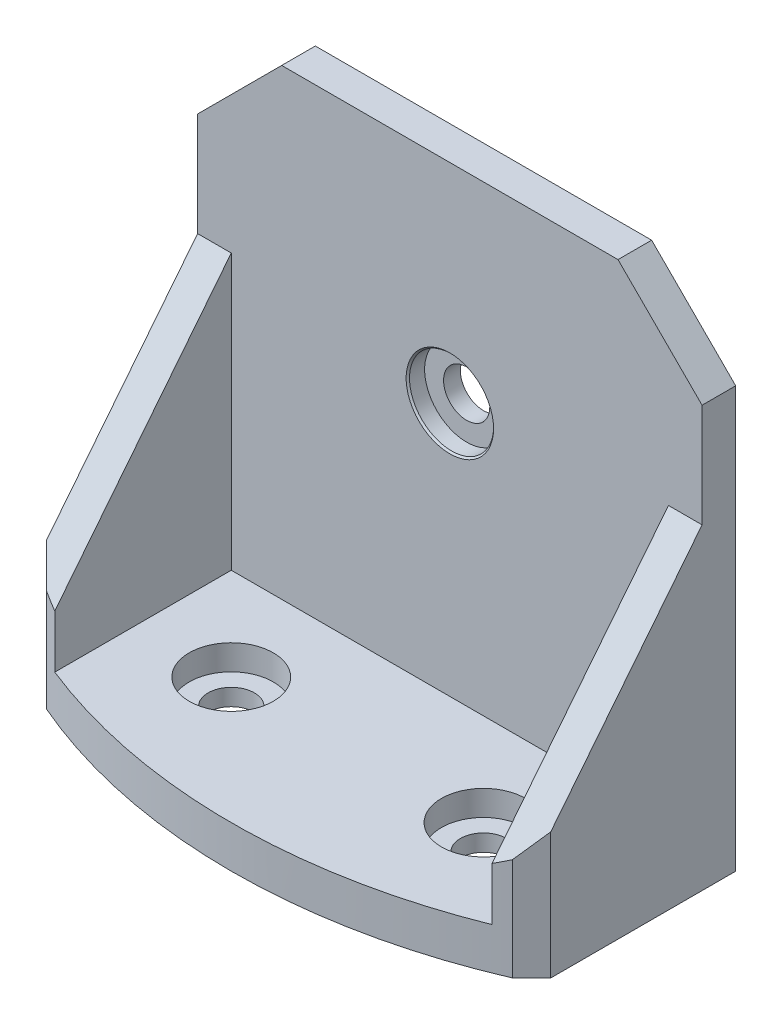
ISO-10303-21;
HEADER;
FILE_DESCRIPTION(('STEP AP214'),'2;1');
FILE_NAME('part.step','',(''),(''),'','','');
FILE_SCHEMA(('AUTOMOTIVE_DESIGN { 1 0 10303 214 1 1 1 1 }'));
ENDSEC;
DATA;
#1=APPLICATION_CONTEXT('core data for automotive mechanical design processes');
#2=APPLICATION_PROTOCOL_DEFINITION('international standard','automotive_design',2000,#1);
#3=PRODUCT_CONTEXT('',#1,'mechanical');
#4=PRODUCT('Part','Part','',(#3));
#5=PRODUCT_RELATED_PRODUCT_CATEGORY('part','',(#4));
#6=PRODUCT_DEFINITION_FORMATION('','',#4);
#7=PRODUCT_DEFINITION_CONTEXT('part definition',#1,'design');
#8=PRODUCT_DEFINITION('design','',#6,#7);
#9=PRODUCT_DEFINITION_SHAPE('','',#8);
#10=(LENGTH_UNIT() NAMED_UNIT(*) SI_UNIT(.MILLI.,.METRE.));
#11=(NAMED_UNIT(*) PLANE_ANGLE_UNIT() SI_UNIT($,.RADIAN.));
#12=(NAMED_UNIT(*) SI_UNIT($,.STERADIAN.) SOLID_ANGLE_UNIT());
#13=UNCERTAINTY_MEASURE_WITH_UNIT(LENGTH_MEASURE(1.E-05),#10,'distance_accuracy_value','');
#14=(GEOMETRIC_REPRESENTATION_CONTEXT(3) GLOBAL_UNCERTAINTY_ASSIGNED_CONTEXT((#13)) GLOBAL_UNIT_ASSIGNED_CONTEXT((#10,
#11,#12)) REPRESENTATION_CONTEXT('',''));
#15=CARTESIAN_POINT('',(0.,0.,0.));
#16=DIRECTION('',(0.,0.,1.));
#17=DIRECTION('',(1.,0.,0.));
#18=AXIS2_PLACEMENT_3D('',#15,#16,#17);
#19=CARTESIAN_POINT('',(0.,58.473541888855,0.));
#20=DIRECTION('',(0.,0.,1.));
#21=DIRECTION('',(1.,0.,0.));
#22=AXIS2_PLACEMENT_3D('',#19,#20,#21);
#23=CYLINDRICAL_SURFACE('',#22,2.75);
#24=CARTESIAN_POINT('',(0.,58.473541888855,0.));
#25=DIRECTION('',(0.,0.,1.));
#26=DIRECTION('',(1.,0.,0.));
#27=AXIS2_PLACEMENT_3D('',#24,#25,#26);
#28=CIRCLE('',#27,2.75);
#29=CARTESIAN_POINT('',(2.75000000000001,58.473541888855,0.));
#30=VERTEX_POINT('',#29);
#31=EDGE_CURVE('E200',#30,#30,#28,.T.);
#32=ORIENTED_EDGE('',*,*,#31,.F.);
#33=EDGE_LOOP('',(#32));
#34=FACE_BOUND('',#33,.T.);
#35=CARTESIAN_POINT('',(0.,58.473541888855,2.));
#36=DIRECTION('',(0.,0.,1.));
#37=DIRECTION('',(1.,0.,0.));
#38=AXIS2_PLACEMENT_3D('',#35,#36,#37);
#39=CIRCLE('',#38,2.75);
#40=CARTESIAN_POINT('',(2.75000000000001,58.473541888855,2.));
#41=VERTEX_POINT('',#40);
#42=EDGE_CURVE('E196',#41,#41,#39,.F.);
#43=ORIENTED_EDGE('',*,*,#42,.F.);
#44=EDGE_LOOP('',(#43));
#45=FACE_BOUND('',#44,.T.);
#46=ADVANCED_FACE('F46',(#34,#45),#23,.F.);
#47=CARTESIAN_POINT('',(-33.8493725389063,28.283541888855,-121.423885974345));
#48=DIRECTION('',(0.,-1.,0.));
#49=DIRECTION('',(0.,0.,-1.));
#50=AXIS2_PLACEMENT_3D('',#47,#48,#49);
#51=PLANE('',#50);
#52=CARTESIAN_POINT('',(-15.,28.283541888855,15.));
#53=DIRECTION('',(0.,1.,0.));
#54=DIRECTION('',(0.,0.,1.));
#55=AXIS2_PLACEMENT_3D('',#52,#53,#54);
#56=CIRCLE('',#55,5.);
#57=CARTESIAN_POINT('',(-15.,28.283541888855,20.));
#58=VERTEX_POINT('',#57);
#59=EDGE_CURVE('E362',#58,#58,#56,.T.);
#60=ORIENTED_EDGE('',*,*,#59,.F.);
#61=EDGE_LOOP('',(#60));
#62=FACE_BOUND('',#61,.T.);
#63=CARTESIAN_POINT('',(15.,28.283541888855,15.));
#64=DIRECTION('',(0.,1.,0.));
#65=DIRECTION('',(0.,0.,1.));
#66=AXIS2_PLACEMENT_3D('',#63,#64,#65);
#67=CIRCLE('',#66,5.);
#68=CARTESIAN_POINT('',(15.,28.283541888855,20.));
#69=VERTEX_POINT('',#68);
#70=EDGE_CURVE('E361',#69,#69,#67,.T.);
#71=ORIENTED_EDGE('',*,*,#70,.F.);
#72=EDGE_LOOP('',(#71));
#73=FACE_BOUND('',#72,.T.);
#74=CARTESIAN_POINT('',(0.,28.283541888855,-40.));
#75=DIRECTION('',(0.,-1.,0.));
#76=DIRECTION('',(0.,0.,-1.));
#77=AXIS2_PLACEMENT_3D('',#74,#75,#76);
#78=CIRCLE('',#77,70.);
#79=CARTESIAN_POINT('',(26.,28.283541888855,24.9923072370877));
#80=VERTEX_POINT('',#79);
#81=CARTESIAN_POINT('',(-26.,28.283541888855,24.9923072370877));
#82=VERTEX_POINT('',#81);
#83=EDGE_CURVE('E358',#80,#82,#78,.T.);
#84=ORIENTED_EDGE('',*,*,#83,.F.);
#85=DIRECTION('',(0.,0.,1.));
#86=VECTOR('',#85,1.);
#87=CARTESIAN_POINT('',(26.,28.283541888855,-121.423885974345));
#88=LINE('',#87,#86);
#89=CARTESIAN_POINT('',(26.,28.283541888855,4.));
#90=VERTEX_POINT('',#89);
#91=EDGE_CURVE('E309',#90,#80,#88,.T.);
#92=ORIENTED_EDGE('',*,*,#91,.F.);
#93=DIRECTION('',(-1.,0.,0.));
#94=VECTOR('',#93,1.);
#95=CARTESIAN_POINT('',(-33.8493725389063,28.283541888855,3.99999999999998));
#96=LINE('',#95,#94);
#97=CARTESIAN_POINT('',(-26.,28.283541888855,3.99999999999998));
#98=VERTEX_POINT('',#97);
#99=EDGE_CURVE('E255',#90,#98,#96,.T.);
#100=ORIENTED_EDGE('',*,*,#99,.T.);
#101=DIRECTION('',(0.,0.,-1.));
#102=VECTOR('',#101,1.);
#103=CARTESIAN_POINT('',(-26.,28.283541888855,-121.423885974345));
#104=LINE('',#103,#102);
#105=EDGE_CURVE('E273',#82,#98,#104,.T.);
#106=ORIENTED_EDGE('',*,*,#105,.F.);
#107=EDGE_LOOP('',(#84,#92,#100,#106));
#108=FACE_BOUND('',#107,.T.);
#109=ADVANCED_FACE('F393',(#62,#73,#108),#51,.F.);
#110=CARTESIAN_POINT('',(-45.,23.283541888855,0.));
#111=DIRECTION('',(0.,-1.,0.));
#112=DIRECTION('',(1.,0.,0.));
#113=AXIS2_PLACEMENT_3D('',#110,#111,#112);
#114=PLANE('',#113);
#115=CARTESIAN_POINT('',(-15.,23.283541888855,15.));
#116=DIRECTION('',(0.,1.,0.));
#117=DIRECTION('',(0.,0.,1.));
#118=AXIS2_PLACEMENT_3D('',#115,#116,#117);
#119=CIRCLE('',#118,2.75);
#120=CARTESIAN_POINT('',(-15.,23.283541888855,17.75));
#121=VERTEX_POINT('',#120);
#122=EDGE_CURVE('E295',#121,#121,#119,.T.);
#123=ORIENTED_EDGE('',*,*,#122,.T.);
#124=EDGE_LOOP('',(#123));
#125=FACE_BOUND('',#124,.T.);
#126=CARTESIAN_POINT('',(15.,23.283541888855,15.));
#127=DIRECTION('',(0.,1.,0.));
#128=DIRECTION('',(0.,0.,1.));
#129=AXIS2_PLACEMENT_3D('',#126,#127,#128);
#130=CIRCLE('',#129,2.75);
#131=CARTESIAN_POINT('',(15.,23.283541888855,17.75));
#132=VERTEX_POINT('',#131);
#133=EDGE_CURVE('E290',#132,#132,#130,.T.);
#134=ORIENTED_EDGE('',*,*,#133,.T.);
#135=EDGE_LOOP('',(#134));
#136=FACE_BOUND('',#135,.T.);
#137=DIRECTION('',(-0.707106781186549,0.,0.707106781186546));
#138=VECTOR('',#137,1.);
#139=CARTESIAN_POINT('',(3.49999999999982,23.283541888855,48.5));
#140=LINE('',#139,#138);
#141=CARTESIAN_POINT('',(30.,23.283541888855,22.));
#142=VERTEX_POINT('',#141);
#143=CARTESIAN_POINT('',(27.7243331175029,23.283541888855,24.2756668824971));
#144=VERTEX_POINT('',#143);
#145=EDGE_CURVE('E157',#142,#144,#140,.T.);
#146=ORIENTED_EDGE('',*,*,#145,.T.);
#147=CARTESIAN_POINT('',(0.,23.283541888855,-40.));
#148=DIRECTION('',(0.,-1.,0.));
#149=DIRECTION('',(1.,0.,0.));
#150=AXIS2_PLACEMENT_3D('',#147,#148,#149);
#151=CIRCLE('',#150,70.);
#152=CARTESIAN_POINT('',(-27.7243331175029,23.283541888855,24.2756668824971));
#153=VERTEX_POINT('',#152);
#154=EDGE_CURVE('E149',#144,#153,#151,.T.);
#155=ORIENTED_EDGE('',*,*,#154,.T.);
#156=DIRECTION('',(-0.707106781186549,0.,-0.707106781186546));
#157=VECTOR('',#156,1.);
#158=CARTESIAN_POINT('',(-48.5,23.283541888855,3.50000000000005));
#159=LINE('',#158,#157);
#160=CARTESIAN_POINT('',(-30.,23.283541888855,22.));
#161=VERTEX_POINT('',#160);
#162=EDGE_CURVE('E154',#153,#161,#159,.T.);
#163=ORIENTED_EDGE('',*,*,#162,.T.);
#164=DIRECTION('',(0.,0.,-1.));
#165=VECTOR('',#164,1.);
#166=CARTESIAN_POINT('',(-30.,23.283541888855,0.));
#167=LINE('',#166,#165);
#168=CARTESIAN_POINT('',(-30.,23.283541888855,0.));
#169=VERTEX_POINT('',#168);
#170=EDGE_CURVE('E268',#161,#169,#167,.T.);
#171=ORIENTED_EDGE('',*,*,#170,.T.);
#172=DIRECTION('',(1.,0.,0.));
#173=VECTOR('',#172,1.);
#174=CARTESIAN_POINT('',(-45.,23.283541888855,0.));
#175=LINE('',#174,#173);
#176=CARTESIAN_POINT('',(30.,23.283541888855,0.));
#177=VERTEX_POINT('',#176);
#178=EDGE_CURVE('E259',#169,#177,#175,.T.);
#179=ORIENTED_EDGE('',*,*,#178,.T.);
#180=DIRECTION('',(0.,0.,1.));
#181=VECTOR('',#180,1.);
#182=CARTESIAN_POINT('',(30.,23.283541888855,0.));
#183=LINE('',#182,#181);
#184=EDGE_CURVE('E252',#177,#142,#183,.T.);
#185=ORIENTED_EDGE('',*,*,#184,.T.);
#186=EDGE_LOOP('',(#146,#155,#163,#171,#179,#185));
#187=FACE_BOUND('',#186,.T.);
#188=ADVANCED_FACE('F151',(#125,#136,#187),#114,.T.);
#189=CARTESIAN_POINT('',(-30.,60.9599104503649,4.));
#190=DIRECTION('',(0.,-0.622632595222004,-0.782514313841678));
#191=DIRECTION('',(0.,-0.782514313841678,0.622632595222004));
#192=AXIS2_PLACEMENT_3D('',#189,#190,#191);
#193=PLANE('',#192);
#194=DIRECTION('',(-0.528552999557653,0.664276639147591,-0.52855299955765));
#195=VECTOR('',#194,1.);
#196=CARTESIAN_POINT('',(-42.971371079855,54.6400130675292,9.02862892014505));
#197=LINE('',#196,#195);
#198=CARTESIAN_POINT('',(-30.,38.3378091385504,22.));
#199=VERTEX_POINT('',#198);
#200=CARTESIAN_POINT('',(-27.7243331175029,35.477788762562,24.2756668824971));
#201=VERTEX_POINT('',#200);
#202=EDGE_CURVE('E172',#199,#201,#197,.F.);
#203=ORIENTED_EDGE('',*,*,#202,.T.);
#204=CARTESIAN_POINT('',(0.,116.258380323689,-40.));
#205=DIRECTION('',(0.,-0.622632595222004,-0.782514313841678));
#206=DIRECTION('',(0.,-0.782514313841678,0.622632595222004));
#207=AXIS2_PLACEMENT_3D('',#204,#205,#206);
#208=ELLIPSE('',#207,112.425851998707,70.);
#209=CARTESIAN_POINT('',(-26.,34.5771270566907,24.9923072370877));
#210=VERTEX_POINT('',#209);
#211=EDGE_CURVE('E162',#201,#210,#208,.F.);
#212=ORIENTED_EDGE('',*,*,#211,.T.);
#213=DIRECTION('',(0.,-0.782514313841678,0.622632595222004));
#214=VECTOR('',#213,1.);
#215=CARTESIAN_POINT('',(-26.,60.9599104503649,4.));
#216=LINE('',#215,#214);
#217=CARTESIAN_POINT('',(-26.,60.9599104503649,4.));
#218=VERTEX_POINT('',#217);
#219=EDGE_CURVE('E316',#218,#210,#216,.T.);
#220=ORIENTED_EDGE('',*,*,#219,.F.);
#221=DIRECTION('',(1.,0.,0.));
#222=VECTOR('',#221,1.);
#223=CARTESIAN_POINT('',(-60.,60.9599104503649,4.));
#224=LINE('',#223,#222);
#225=CARTESIAN_POINT('',(-30.,60.9599104503649,4.));
#226=VERTEX_POINT('',#225);
#227=EDGE_CURVE('E262',#218,#226,#224,.F.);
#228=ORIENTED_EDGE('',*,*,#227,.T.);
#229=DIRECTION('',(0.,-0.782514313841678,0.622632595222004));
#230=VECTOR('',#229,1.);
#231=CARTESIAN_POINT('',(-30.,60.9599104503649,4.));
#232=LINE('',#231,#230);
#233=EDGE_CURVE('E317',#226,#199,#232,.T.);
#234=ORIENTED_EDGE('',*,*,#233,.T.);
#235=EDGE_LOOP('',(#203,#212,#220,#228,#234));
#236=FACE_BOUND('',#235,.T.);
#237=ADVANCED_FACE('F331',(#236),#193,.F.);
#238=CARTESIAN_POINT('',(-26.,61.6417709444275,15.));
#239=DIRECTION('',(-1.,0.,0.));
#240=DIRECTION('',(0.,-1.,0.));
#241=AXIS2_PLACEMENT_3D('',#238,#239,#240);
#242=PLANE('',#241);
#243=DIRECTION('',(0.,-1.,0.));
#244=VECTOR('',#243,1.);
#245=CARTESIAN_POINT('',(-26.,100.,24.9923072370877));
#246=LINE('',#245,#244);
#247=EDGE_CURVE('E355',#82,#210,#246,.F.);
#248=ORIENTED_EDGE('',*,*,#247,.F.);
#249=ORIENTED_EDGE('',*,*,#105,.T.);
#250=DIRECTION('',(0.,-1.,0.));
#251=VECTOR('',#250,1.);
#252=CARTESIAN_POINT('',(-26.,100.,4.));
#253=LINE('',#252,#251);
#254=EDGE_CURVE('E321',#218,#98,#253,.T.);
#255=ORIENTED_EDGE('',*,*,#254,.F.);
#256=ORIENTED_EDGE('',*,*,#219,.T.);
#257=EDGE_LOOP('',(#248,#249,#255,#256));
#258=FACE_BOUND('',#257,.T.);
#259=ADVANCED_FACE('F432',(#258),#242,.F.);
#260=CARTESIAN_POINT('',(26.,61.6417709444275,15.));
#261=DIRECTION('',(1.,0.,0.));
#262=DIRECTION('',(0.,1.,0.));
#263=AXIS2_PLACEMENT_3D('',#260,#261,#262);
#264=PLANE('',#263);
#265=DIRECTION('',(0.,-1.,0.));
#266=VECTOR('',#265,1.);
#267=CARTESIAN_POINT('',(26.,100.,24.9923072370877));
#268=LINE('',#267,#266);
#269=CARTESIAN_POINT('',(26.,34.5771270566907,24.9923072370877));
#270=VERTEX_POINT('',#269);
#271=EDGE_CURVE('E352',#270,#80,#268,.T.);
#272=ORIENTED_EDGE('',*,*,#271,.F.);
#273=DIRECTION('',(0.,-0.782514313841679,0.622632595222003));
#274=VECTOR('',#273,1.);
#275=CARTESIAN_POINT('',(26.,60.959910450365,4.));
#276=LINE('',#275,#274);
#277=CARTESIAN_POINT('',(26.,60.959910450365,4.));
#278=VERTEX_POINT('',#277);
#279=EDGE_CURVE('E301',#278,#270,#276,.T.);
#280=ORIENTED_EDGE('',*,*,#279,.F.);
#281=DIRECTION('',(0.,1.,0.));
#282=VECTOR('',#281,1.);
#283=CARTESIAN_POINT('',(26.,100.,4.));
#284=LINE('',#283,#282);
#285=EDGE_CURVE('E276',#90,#278,#284,.T.);
#286=ORIENTED_EDGE('',*,*,#285,.F.);
#287=ORIENTED_EDGE('',*,*,#91,.T.);
#288=EDGE_LOOP('',(#272,#280,#286,#287));
#289=FACE_BOUND('',#288,.T.);
#290=ADVANCED_FACE('F560',(#289),#264,.F.);
#291=CARTESIAN_POINT('',(30.,60.959910450365,4.));
#292=DIRECTION('',(0.,0.622632595222003,0.782514313841679));
#293=DIRECTION('',(0.,-0.782514313841679,0.622632595222003));
#294=AXIS2_PLACEMENT_3D('',#291,#292,#293);
#295=PLANE('',#294);
#296=ORIENTED_EDGE('',*,*,#279,.T.);
#297=CARTESIAN_POINT('',(0.,116.25838032369,-40.));
#298=DIRECTION('',(0.,0.622632595222003,0.782514313841679));
#299=DIRECTION('',(0.,-0.782514313841679,0.622632595222003));
#300=AXIS2_PLACEMENT_3D('',#297,#298,#299);
#301=ELLIPSE('',#300,112.425851998707,70.);
#302=CARTESIAN_POINT('',(27.7243331175029,35.477788762562,24.2756668824971));
#303=VERTEX_POINT('',#302);
#304=EDGE_CURVE('E348',#270,#303,#301,.T.);
#305=ORIENTED_EDGE('',*,*,#304,.T.);
#306=DIRECTION('',(0.528552999557652,0.664276639147592,-0.52855299955765));
#307=VECTOR('',#306,1.);
#308=CARTESIAN_POINT('',(42.971371079855,54.6400130675293,9.02862892014504));
#309=LINE('',#308,#307);
#310=CARTESIAN_POINT('',(30.,38.3378091385504,22.));
#311=VERTEX_POINT('',#310);
#312=EDGE_CURVE('E183',#303,#311,#309,.T.);
#313=ORIENTED_EDGE('',*,*,#312,.T.);
#314=DIRECTION('',(0.,-0.782514313841679,0.622632595222003));
#315=VECTOR('',#314,1.);
#316=CARTESIAN_POINT('',(30.,60.959910450365,4.));
#317=LINE('',#316,#315);
#318=CARTESIAN_POINT('',(30.,60.959910450365,4.));
#319=VERTEX_POINT('',#318);
#320=EDGE_CURVE('E305',#319,#311,#317,.T.);
#321=ORIENTED_EDGE('',*,*,#320,.F.);
#322=DIRECTION('',(-1.,0.,0.));
#323=VECTOR('',#322,1.);
#324=CARTESIAN_POINT('',(-60.,60.959910450365,4.));
#325=LINE('',#324,#323);
#326=EDGE_CURVE('E186',#319,#278,#325,.T.);
#327=ORIENTED_EDGE('',*,*,#326,.T.);
#328=EDGE_LOOP('',(#296,#305,#313,#321,#327));
#329=FACE_BOUND('',#328,.T.);
#330=ADVANCED_FACE('F446',(#329),#295,.T.);
#331=CARTESIAN_POINT('',(30.,147.336146250847,22.));
#332=DIRECTION('',(0.707106781186546,0.,0.707106781186549));
#333=DIRECTION('',(0.,1.,0.));
#334=AXIS2_PLACEMENT_3D('',#331,#332,#333);
#335=PLANE('',#334);
#336=ORIENTED_EDGE('',*,*,#312,.F.);
#337=DIRECTION('',(0.,-1.,0.));
#338=VECTOR('',#337,1.);
#339=CARTESIAN_POINT('',(27.7243331175028,100.,24.2756668824971));
#340=LINE('',#339,#338);
#341=EDGE_CURVE('E161',#303,#144,#340,.T.);
#342=ORIENTED_EDGE('',*,*,#341,.T.);
#343=ORIENTED_EDGE('',*,*,#145,.F.);
#344=DIRECTION('',(0.,-1.,0.));
#345=VECTOR('',#344,1.);
#346=CARTESIAN_POINT('',(30.,23.283541888855,22.));
#347=LINE('',#346,#345);
#348=EDGE_CURVE('E179',#311,#142,#347,.T.);
#349=ORIENTED_EDGE('',*,*,#348,.F.);
#350=EDGE_LOOP('',(#336,#342,#343,#349));
#351=FACE_BOUND('',#350,.T.);
#352=ADVANCED_FACE('F440',(#351),#335,.T.);
#353=CARTESIAN_POINT('',(-30.,147.336146250847,22.));
#354=DIRECTION('',(-0.707106781186546,0.,0.707106781186549));
#355=DIRECTION('',(0.,-1.,0.));
#356=AXIS2_PLACEMENT_3D('',#353,#354,#355);
#357=PLANE('',#356);
#358=ORIENTED_EDGE('',*,*,#162,.F.);
#359=DIRECTION('',(0.,-1.,0.));
#360=VECTOR('',#359,1.);
#361=CARTESIAN_POINT('',(-27.7243331175029,100.,24.2756668824971));
#362=LINE('',#361,#360);
#363=EDGE_CURVE('E165',#153,#201,#362,.F.);
#364=ORIENTED_EDGE('',*,*,#363,.T.);
#365=ORIENTED_EDGE('',*,*,#202,.F.);
#366=DIRECTION('',(0.,1.,0.));
#367=VECTOR('',#366,1.);
#368=CARTESIAN_POINT('',(-30.,28.283541888855,22.));
#369=LINE('',#368,#367);
#370=EDGE_CURVE('E177',#161,#199,#369,.T.);
#371=ORIENTED_EDGE('',*,*,#370,.F.);
#372=EDGE_LOOP('',(#358,#364,#365,#371));
#373=FACE_BOUND('',#372,.T.);
#374=ADVANCED_FACE('F175',(#373),#357,.T.);
#375=CARTESIAN_POINT('',(-60.,100.,0.));
#376=DIRECTION('',(0.,0.,1.));
#377=DIRECTION('',(1.,0.,0.));
#378=AXIS2_PLACEMENT_3D('',#375,#376,#377);
#379=PLANE('',#378);
#380=ORIENTED_EDGE('',*,*,#31,.T.);
#381=EDGE_LOOP('',(#380));
#382=FACE_BOUND('',#381,.T.);
#383=DIRECTION('',(1.,0.,0.));
#384=VECTOR('',#383,1.);
#385=CARTESIAN_POINT('',(-49.4806872171203,83.283541888855,0.));
#386=LINE('',#385,#384);
#387=CARTESIAN_POINT('',(-20.,83.283541888855,0.));
#388=VERTEX_POINT('',#387);
#389=CARTESIAN_POINT('',(20.,83.283541888855,0.));
#390=VERTEX_POINT('',#389);
#391=EDGE_CURVE('E249',#388,#390,#386,.T.);
#392=ORIENTED_EDGE('',*,*,#391,.T.);
#393=DIRECTION('',(0.707106781186546,-0.707106781186549,0.));
#394=VECTOR('',#393,1.);
#395=CARTESIAN_POINT('',(20.,83.283541888855,0.));
#396=LINE('',#395,#394);
#397=CARTESIAN_POINT('',(30.,73.283541888855,0.));
#398=VERTEX_POINT('',#397);
#399=EDGE_CURVE('E224',#390,#398,#396,.T.);
#400=ORIENTED_EDGE('',*,*,#399,.T.);
#401=DIRECTION('',(0.,1.,0.));
#402=VECTOR('',#401,1.);
#403=CARTESIAN_POINT('',(30.,147.336146250847,0.));
#404=LINE('',#403,#402);
#405=EDGE_CURVE('E248',#177,#398,#404,.T.);
#406=ORIENTED_EDGE('',*,*,#405,.F.);
#407=ORIENTED_EDGE('',*,*,#178,.F.);
#408=DIRECTION('',(0.,-1.,0.));
#409=VECTOR('',#408,1.);
#410=CARTESIAN_POINT('',(-30.,147.336146250847,0.));
#411=LINE('',#410,#409);
#412=CARTESIAN_POINT('',(-30.,73.283541888855,0.));
#413=VERTEX_POINT('',#412);
#414=EDGE_CURVE('E254',#413,#169,#411,.T.);
#415=ORIENTED_EDGE('',*,*,#414,.F.);
#416=DIRECTION('',(0.707106781186546,0.707106781186549,0.));
#417=VECTOR('',#416,1.);
#418=CARTESIAN_POINT('',(-20.,83.283541888855,0.));
#419=LINE('',#418,#417);
#420=EDGE_CURVE('E221',#413,#388,#419,.T.);
#421=ORIENTED_EDGE('',*,*,#420,.T.);
#422=EDGE_LOOP('',(#392,#400,#406,#407,#415,#421));
#423=FACE_BOUND('',#422,.T.);
#424=ADVANCED_FACE('F246',(#382,#423),#379,.F.);
#425=CARTESIAN_POINT('',(-30.,147.336146250847,0.));
#426=DIRECTION('',(-1.,0.,0.));
#427=DIRECTION('',(0.,-1.,0.));
#428=AXIS2_PLACEMENT_3D('',#425,#426,#427);
#429=PLANE('',#428);
#430=DIRECTION('',(0.,1.,0.));
#431=VECTOR('',#430,1.);
#432=CARTESIAN_POINT('',(-30.,100.959910450365,4.));
#433=LINE('',#432,#431);
#434=CARTESIAN_POINT('',(-30.,73.283541888855,4.));
#435=VERTEX_POINT('',#434);
#436=EDGE_CURVE('E335',#226,#435,#433,.T.);
#437=ORIENTED_EDGE('',*,*,#436,.T.);
#438=DIRECTION('',(0.,0.,-1.));
#439=VECTOR('',#438,1.);
#440=CARTESIAN_POINT('',(-30.,73.283541888855,0.));
#441=LINE('',#440,#439);
#442=EDGE_CURVE('E13',#435,#413,#441,.T.);
#443=ORIENTED_EDGE('',*,*,#442,.T.);
#444=ORIENTED_EDGE('',*,*,#414,.T.);
#445=ORIENTED_EDGE('',*,*,#170,.F.);
#446=ORIENTED_EDGE('',*,*,#370,.T.);
#447=ORIENTED_EDGE('',*,*,#233,.F.);
#448=EDGE_LOOP('',(#437,#443,#444,#445,#446,#447));
#449=FACE_BOUND('',#448,.T.);
#450=ADVANCED_FACE('F334',(#449),#429,.T.);
#451=CARTESIAN_POINT('',(30.,147.336146250847,0.));
#452=DIRECTION('',(1.,0.,0.));
#453=DIRECTION('',(0.,1.,0.));
#454=AXIS2_PLACEMENT_3D('',#451,#452,#453);
#455=PLANE('',#454);
#456=ORIENTED_EDGE('',*,*,#405,.T.);
#457=DIRECTION('',(0.,0.,1.));
#458=VECTOR('',#457,1.);
#459=CARTESIAN_POINT('',(30.,73.283541888855,4.));
#460=LINE('',#459,#458);
#461=CARTESIAN_POINT('',(30.,73.283541888855,4.));
#462=VERTEX_POINT('',#461);
#463=EDGE_CURVE('E71',#398,#462,#460,.T.);
#464=ORIENTED_EDGE('',*,*,#463,.T.);
#465=DIRECTION('',(0.,-1.,0.));
#466=VECTOR('',#465,1.);
#467=CARTESIAN_POINT('',(30.,100.959910450365,4.));
#468=LINE('',#467,#466);
#469=EDGE_CURVE('E235',#462,#319,#468,.T.);
#470=ORIENTED_EDGE('',*,*,#469,.T.);
#471=ORIENTED_EDGE('',*,*,#320,.T.);
#472=ORIENTED_EDGE('',*,*,#348,.T.);
#473=ORIENTED_EDGE('',*,*,#184,.F.);
#474=EDGE_LOOP('',(#456,#464,#470,#471,#472,#473));
#475=FACE_BOUND('',#474,.T.);
#476=ADVANCED_FACE('F251',(#475),#455,.T.);
#477=CARTESIAN_POINT('',(-60.,100.,4.));
#478=DIRECTION('',(0.,0.,1.));
#479=DIRECTION('',(1.,0.,0.));
#480=AXIS2_PLACEMENT_3D('',#477,#478,#479);
#481=PLANE('',#480);
#482=ORIENTED_EDGE('',*,*,#469,.F.);
#483=DIRECTION('',(-0.707106781186546,0.707106781186549,0.));
#484=VECTOR('',#483,1.);
#485=CARTESIAN_POINT('',(-28.3582290555723,131.641770944428,4.));
#486=LINE('',#485,#484);
#487=CARTESIAN_POINT('',(20.,83.283541888855,4.));
#488=VERTEX_POINT('',#487);
#489=EDGE_CURVE('E56',#462,#488,#486,.T.);
#490=ORIENTED_EDGE('',*,*,#489,.T.);
#491=DIRECTION('',(1.,0.,0.));
#492=VECTOR('',#491,1.);
#493=CARTESIAN_POINT('',(-60.,83.283541888855,4.));
#494=LINE('',#493,#492);
#495=CARTESIAN_POINT('',(-20.,83.283541888855,4.));
#496=VERTEX_POINT('',#495);
#497=EDGE_CURVE('E209',#496,#488,#494,.T.);
#498=ORIENTED_EDGE('',*,*,#497,.F.);
#499=DIRECTION('',(-0.707106781186546,-0.707106781186549,0.));
#500=VECTOR('',#499,1.);
#501=CARTESIAN_POINT('',(-31.6417709444274,71.6417709444275,4.));
#502=LINE('',#501,#500);
#503=EDGE_CURVE('E63',#496,#435,#502,.T.);
#504=ORIENTED_EDGE('',*,*,#503,.T.);
#505=ORIENTED_EDGE('',*,*,#436,.F.);
#506=ORIENTED_EDGE('',*,*,#227,.F.);
#507=ORIENTED_EDGE('',*,*,#254,.T.);
#508=ORIENTED_EDGE('',*,*,#99,.F.);
#509=ORIENTED_EDGE('',*,*,#285,.T.);
#510=ORIENTED_EDGE('',*,*,#326,.F.);
#511=EDGE_LOOP('',(#482,#490,#498,#504,#505,#506,#507,#508,#509,#510));
#512=FACE_BOUND('',#511,.T.);
#513=CARTESIAN_POINT('',(0.,58.473541888855,4.));
#514=DIRECTION('',(0.,0.,1.));
#515=DIRECTION('',(1.,0.,0.));
#516=AXIS2_PLACEMENT_3D('',#513,#514,#515);
#517=CIRCLE('',#516,5.2);
#518=CARTESIAN_POINT('',(5.2,58.473541888855,4.));
#519=VERTEX_POINT('',#518);
#520=EDGE_CURVE('E205',#519,#519,#517,.F.);
#521=ORIENTED_EDGE('',*,*,#520,.T.);
#522=EDGE_LOOP('',(#521));
#523=FACE_BOUND('',#522,.T.);
#524=ADVANCED_FACE('F232',(#512,#523),#481,.T.);
#525=CARTESIAN_POINT('',(15.,23.283541888855,15.));
#526=DIRECTION('',(0.,1.,0.));
#527=DIRECTION('',(0.,0.,1.));
#528=AXIS2_PLACEMENT_3D('',#525,#526,#527);
#529=CYLINDRICAL_SURFACE('',#528,2.75);
#530=CARTESIAN_POINT('',(15.,25.283541888855,15.));
#531=DIRECTION('',(0.,-1.,0.));
#532=DIRECTION('',(1.,0.,0.));
#533=AXIS2_PLACEMENT_3D('',#530,#531,#532);
#534=CIRCLE('',#533,2.75);
#535=CARTESIAN_POINT('',(17.75,25.283541888855,15.));
#536=VERTEX_POINT('',#535);
#537=EDGE_CURVE('E286',#536,#536,#534,.F.);
#538=ORIENTED_EDGE('',*,*,#537,.T.);
#539=EDGE_LOOP('',(#538));
#540=FACE_BOUND('',#539,.T.);
#541=ORIENTED_EDGE('',*,*,#133,.F.);
#542=EDGE_LOOP('',(#541));
#543=FACE_BOUND('',#542,.T.);
#544=ADVANCED_FACE('F417',(#540,#543),#529,.F.);
#545=CARTESIAN_POINT('',(-15.,23.283541888855,15.));
#546=DIRECTION('',(0.,1.,0.));
#547=DIRECTION('',(0.,0.,1.));
#548=AXIS2_PLACEMENT_3D('',#545,#546,#547);
#549=CYLINDRICAL_SURFACE('',#548,2.75);
#550=CARTESIAN_POINT('',(-15.,25.283541888855,15.));
#551=DIRECTION('',(0.,-1.,0.));
#552=DIRECTION('',(1.,0.,0.));
#553=AXIS2_PLACEMENT_3D('',#550,#551,#552);
#554=CIRCLE('',#553,2.75);
#555=CARTESIAN_POINT('',(-12.25,25.283541888855,15.));
#556=VERTEX_POINT('',#555);
#557=EDGE_CURVE('E283',#556,#556,#554,.F.);
#558=ORIENTED_EDGE('',*,*,#557,.T.);
#559=EDGE_LOOP('',(#558));
#560=FACE_BOUND('',#559,.T.);
#561=ORIENTED_EDGE('',*,*,#122,.F.);
#562=EDGE_LOOP('',(#561));
#563=FACE_BOUND('',#562,.T.);
#564=ADVANCED_FACE('F412',(#560,#563),#549,.F.);
#565=CARTESIAN_POINT('',(-45.,25.283541888855,0.));
#566=DIRECTION('',(0.,-1.,0.));
#567=DIRECTION('',(1.,0.,0.));
#568=AXIS2_PLACEMENT_3D('',#565,#566,#567);
#569=PLANE('',#568);
#570=CARTESIAN_POINT('',(-15.,25.283541888855,15.));
#571=DIRECTION('',(0.,-1.,0.));
#572=DIRECTION('',(1.,0.,0.));
#573=AXIS2_PLACEMENT_3D('',#570,#571,#572);
#574=CIRCLE('',#573,5.);
#575=CARTESIAN_POINT('',(-10.,25.283541888855,15.));
#576=VERTEX_POINT('',#575);
#577=EDGE_CURVE('E287',#576,#576,#574,.F.);
#578=ORIENTED_EDGE('',*,*,#577,.T.);
#579=EDGE_LOOP('',(#578));
#580=FACE_BOUND('',#579,.T.);
#581=ORIENTED_EDGE('',*,*,#557,.F.);
#582=EDGE_LOOP('',(#581));
#583=FACE_BOUND('',#582,.T.);
#584=ADVANCED_FACE('F409',(#580,#583),#569,.F.);
#585=CARTESIAN_POINT('',(-15.,9.14140626512407,15.));
#586=DIRECTION('',(0.,1.,0.));
#587=DIRECTION('',(0.,0.,1.));
#588=AXIS2_PLACEMENT_3D('',#585,#586,#587);
#589=CYLINDRICAL_SURFACE('',#588,5.);
#590=ORIENTED_EDGE('',*,*,#59,.T.);
#591=EDGE_LOOP('',(#590));
#592=FACE_BOUND('',#591,.T.);
#593=ORIENTED_EDGE('',*,*,#577,.F.);
#594=EDGE_LOOP('',(#593));
#595=FACE_BOUND('',#594,.T.);
#596=ADVANCED_FACE('F389',(#592,#595),#589,.F.);
#597=CARTESIAN_POINT('',(-45.,25.283541888855,0.));
#598=DIRECTION('',(0.,-1.,0.));
#599=DIRECTION('',(1.,0.,0.));
#600=AXIS2_PLACEMENT_3D('',#597,#598,#599);
#601=PLANE('',#600);
#602=CARTESIAN_POINT('',(15.,25.283541888855,15.));
#603=DIRECTION('',(0.,-1.,0.));
#604=DIRECTION('',(1.,0.,0.));
#605=AXIS2_PLACEMENT_3D('',#602,#603,#604);
#606=CIRCLE('',#605,5.);
#607=CARTESIAN_POINT('',(20.,25.283541888855,15.));
#608=VERTEX_POINT('',#607);
#609=EDGE_CURVE('E366',#608,#608,#606,.F.);
#610=ORIENTED_EDGE('',*,*,#609,.T.);
#611=EDGE_LOOP('',(#610));
#612=FACE_BOUND('',#611,.T.);
#613=ORIENTED_EDGE('',*,*,#537,.F.);
#614=EDGE_LOOP('',(#613));
#615=FACE_BOUND('',#614,.T.);
#616=ADVANCED_FACE('F376',(#612,#615),#601,.F.);
#617=CARTESIAN_POINT('',(15.,9.14140626512407,15.));
#618=DIRECTION('',(0.,1.,0.));
#619=DIRECTION('',(0.,0.,1.));
#620=AXIS2_PLACEMENT_3D('',#617,#618,#619);
#621=CYLINDRICAL_SURFACE('',#620,5.);
#622=ORIENTED_EDGE('',*,*,#70,.T.);
#623=EDGE_LOOP('',(#622));
#624=FACE_BOUND('',#623,.T.);
#625=ORIENTED_EDGE('',*,*,#609,.F.);
#626=EDGE_LOOP('',(#625));
#627=FACE_BOUND('',#626,.T.);
#628=ADVANCED_FACE('F379',(#624,#627),#621,.F.);
#629=CARTESIAN_POINT('',(0.,100.,-40.));
#630=DIRECTION('',(0.,-1.,0.));
#631=DIRECTION('',(1.,0.,0.));
#632=AXIS2_PLACEMENT_3D('',#629,#630,#631);
#633=CYLINDRICAL_SURFACE('',#632,70.);
#634=ORIENTED_EDGE('',*,*,#83,.T.);
#635=ORIENTED_EDGE('',*,*,#247,.T.);
#636=ORIENTED_EDGE('',*,*,#211,.F.);
#637=ORIENTED_EDGE('',*,*,#363,.F.);
#638=ORIENTED_EDGE('',*,*,#154,.F.);
#639=ORIENTED_EDGE('',*,*,#341,.F.);
#640=ORIENTED_EDGE('',*,*,#304,.F.);
#641=ORIENTED_EDGE('',*,*,#271,.T.);
#642=EDGE_LOOP('',(#634,#635,#636,#637,#638,#639,#640,#641));
#643=FACE_BOUND('',#642,.T.);
#644=ADVANCED_FACE('F166',(#643),#633,.T.);
#645=CARTESIAN_POINT('',(0.,58.473541888855,2.));
#646=DIRECTION('',(0.,0.,1.));
#647=DIRECTION('',(1.,0.,0.));
#648=AXIS2_PLACEMENT_3D('',#645,#646,#647);
#649=PLANE('',#648);
#650=CARTESIAN_POINT('',(0.,58.473541888855,2.));
#651=DIRECTION('',(0.,0.,1.));
#652=DIRECTION('',(1.,0.,0.));
#653=AXIS2_PLACEMENT_3D('',#650,#651,#652);
#654=CIRCLE('',#653,5.);
#655=CARTESIAN_POINT('',(5.00000000000001,58.473541888855,2.));
#656=VERTEX_POINT('',#655);
#657=EDGE_CURVE('E201',#656,#656,#654,.T.);
#658=ORIENTED_EDGE('',*,*,#657,.T.);
#659=EDGE_LOOP('',(#658));
#660=FACE_BOUND('',#659,.T.);
#661=ORIENTED_EDGE('',*,*,#42,.T.);
#662=EDGE_LOOP('',(#661));
#663=FACE_BOUND('',#662,.T.);
#664=ADVANCED_FACE('F387',(#660,#663),#649,.T.);
#665=CARTESIAN_POINT('',(0.,58.473541888855,2.));
#666=DIRECTION('',(0.,0.,1.));
#667=DIRECTION('',(1.,0.,0.));
#668=AXIS2_PLACEMENT_3D('',#665,#666,#667);
#669=CYLINDRICAL_SURFACE('',#668,5.);
#670=CARTESIAN_POINT('',(0.,58.473541888855,3.80000000000001));
#671=DIRECTION('',(0.,0.,1.));
#672=DIRECTION('',(1.,0.,0.));
#673=AXIS2_PLACEMENT_3D('',#670,#671,#672);
#674=CIRCLE('',#673,5.);
#675=CARTESIAN_POINT('',(5.00000000000001,58.473541888855,3.80000000000001));
#676=VERTEX_POINT('',#675);
#677=EDGE_CURVE('E171',#676,#676,#674,.T.);
#678=ORIENTED_EDGE('',*,*,#677,.T.);
#679=EDGE_LOOP('',(#678));
#680=FACE_BOUND('',#679,.T.);
#681=ORIENTED_EDGE('',*,*,#657,.F.);
#682=EDGE_LOOP('',(#681));
#683=FACE_BOUND('',#682,.T.);
#684=ADVANCED_FACE('F405',(#680,#683),#669,.F.);
#685=CARTESIAN_POINT('',(0.,58.473541888855,3.80000000000001));
#686=DIRECTION('',(0.,0.,1.));
#687=DIRECTION('',(1.,0.,0.));
#688=AXIS2_PLACEMENT_3D('',#685,#686,#687);
#689=CONICAL_SURFACE('',#688,5.,0.78539816339745);
#690=ORIENTED_EDGE('',*,*,#520,.F.);
#691=EDGE_LOOP('',(#690));
#692=FACE_BOUND('',#691,.T.);
#693=ORIENTED_EDGE('',*,*,#677,.F.);
#694=EDGE_LOOP('',(#693));
#695=FACE_BOUND('',#694,.T.);
#696=ADVANCED_FACE('F453',(#692,#695),#689,.F.);
#697=CARTESIAN_POINT('',(-49.4806872171203,83.283541888855,0.));
#698=DIRECTION('',(0.,-1.,0.));
#699=DIRECTION('',(0.,0.,-1.));
#700=AXIS2_PLACEMENT_3D('',#697,#698,#699);
#701=PLANE('',#700);
#702=ORIENTED_EDGE('',*,*,#497,.T.);
#703=DIRECTION('',(0.,0.,-1.));
#704=VECTOR('',#703,1.);
#705=CARTESIAN_POINT('',(20.,83.283541888855,0.));
#706=LINE('',#705,#704);
#707=EDGE_CURVE('E217',#488,#390,#706,.T.);
#708=ORIENTED_EDGE('',*,*,#707,.T.);
#709=ORIENTED_EDGE('',*,*,#391,.F.);
#710=DIRECTION('',(0.,0.,1.));
#711=VECTOR('',#710,1.);
#712=CARTESIAN_POINT('',(-20.,83.283541888855,4.));
#713=LINE('',#712,#711);
#714=EDGE_CURVE('E213',#388,#496,#713,.T.);
#715=ORIENTED_EDGE('',*,*,#714,.T.);
#716=EDGE_LOOP('',(#702,#708,#709,#715));
#717=FACE_BOUND('',#716,.T.);
#718=ADVANCED_FACE('F239',(#717),#701,.F.);
#719=CARTESIAN_POINT('',(20.,83.283541888855,0.));
#720=DIRECTION('',(0.707106781186549,0.707106781186546,0.));
#721=DIRECTION('',(0.,0.,1.));
#722=AXIS2_PLACEMENT_3D('',#719,#720,#721);
#723=PLANE('',#722);
#724=ORIENTED_EDGE('',*,*,#489,.F.);
#725=ORIENTED_EDGE('',*,*,#463,.F.);
#726=ORIENTED_EDGE('',*,*,#399,.F.);
#727=ORIENTED_EDGE('',*,*,#707,.F.);
#728=EDGE_LOOP('',(#724,#725,#726,#727));
#729=FACE_BOUND('',#728,.T.);
#730=ADVANCED_FACE('F243',(#729),#723,.T.);
#731=CARTESIAN_POINT('',(-20.,83.283541888855,0.));
#732=DIRECTION('',(-0.707106781186549,0.707106781186546,0.));
#733=DIRECTION('',(0.,0.,-1.));
#734=AXIS2_PLACEMENT_3D('',#731,#732,#733);
#735=PLANE('',#734);
#736=ORIENTED_EDGE('',*,*,#420,.F.);
#737=ORIENTED_EDGE('',*,*,#442,.F.);
#738=ORIENTED_EDGE('',*,*,#503,.F.);
#739=ORIENTED_EDGE('',*,*,#714,.F.);
#740=EDGE_LOOP('',(#736,#737,#738,#739));
#741=FACE_BOUND('',#740,.T.);
#742=ADVANCED_FACE('F49',(#741),#735,.T.);
#743=CLOSED_SHELL('',(#46,#109,#188,#237,#259,#290,#330,#352,#374,#424,#450,#476,#524,#544,#564,
#584,#596,#616,#628,#644,#664,#684,#696,#718,#730,#742));
#744=MANIFOLD_SOLID_BREP('B2',#743);
#745=ADVANCED_BREP_SHAPE_REPRESENTATION('',(#18,#744),#14);
#746=SHAPE_DEFINITION_REPRESENTATION(#9,#745);
ENDSEC;
END-ISO-10303-21;
